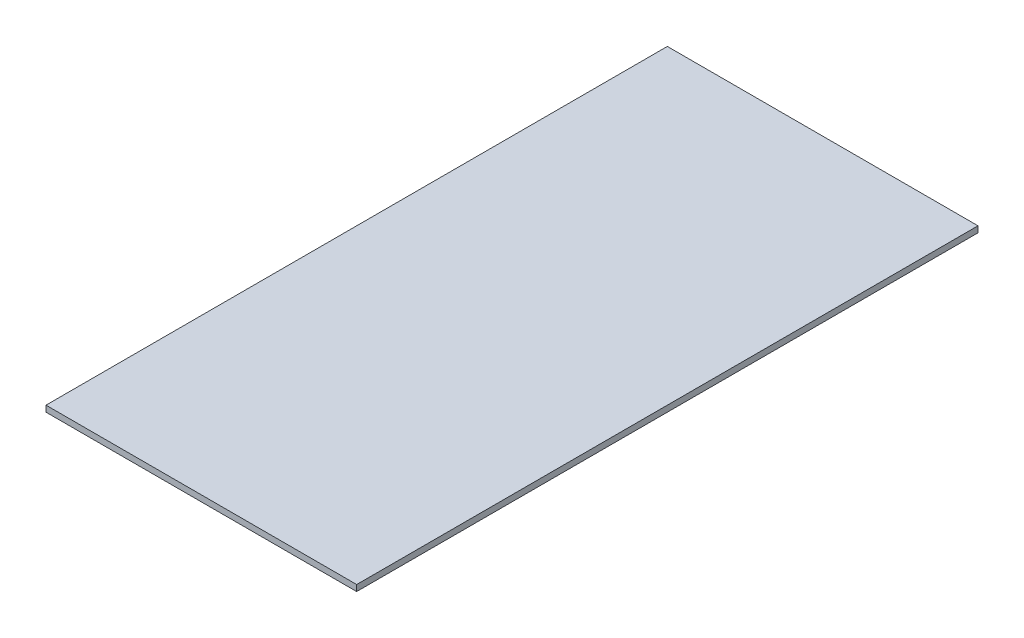
ISO-10303-21;
HEADER;
FILE_DESCRIPTION(('STEP AP214'),'2;1');
FILE_NAME('part.step','',(''),(''),'','','');
FILE_SCHEMA(('AUTOMOTIVE_DESIGN { 1 0 10303 214 1 1 1 1 }'));
ENDSEC;
DATA;
#1=APPLICATION_CONTEXT('core data for automotive mechanical design processes');
#2=APPLICATION_PROTOCOL_DEFINITION('international standard','automotive_design',2000,#1);
#3=PRODUCT_CONTEXT('',#1,'mechanical');
#4=PRODUCT('Part','Part','',(#3));
#5=PRODUCT_RELATED_PRODUCT_CATEGORY('part','',(#4));
#6=PRODUCT_DEFINITION_FORMATION('','',#4);
#7=PRODUCT_DEFINITION_CONTEXT('part definition',#1,'design');
#8=PRODUCT_DEFINITION('design','',#6,#7);
#9=PRODUCT_DEFINITION_SHAPE('','',#8);
#10=(LENGTH_UNIT() NAMED_UNIT(*) SI_UNIT(.MILLI.,.METRE.));
#11=(NAMED_UNIT(*) PLANE_ANGLE_UNIT() SI_UNIT($,.RADIAN.));
#12=(NAMED_UNIT(*) SI_UNIT($,.STERADIAN.) SOLID_ANGLE_UNIT());
#13=UNCERTAINTY_MEASURE_WITH_UNIT(LENGTH_MEASURE(1.E-05),#10,'distance_accuracy_value','');
#14=(GEOMETRIC_REPRESENTATION_CONTEXT(3) GLOBAL_UNCERTAINTY_ASSIGNED_CONTEXT((#13)) GLOBAL_UNIT_ASSIGNED_CONTEXT((#10,
#11,#12)) REPRESENTATION_CONTEXT('',''));
#15=CARTESIAN_POINT('',(0.,0.,0.));
#16=DIRECTION('',(0.,0.,1.));
#17=DIRECTION('',(1.,0.,0.));
#18=AXIS2_PLACEMENT_3D('',#15,#16,#17);
#19=CARTESIAN_POINT('',(25.4,1.,50.8));
#20=DIRECTION('',(-1.,0.,0.));
#21=DIRECTION('',(0.,0.,1.));
#22=AXIS2_PLACEMENT_3D('',#19,#20,#21);
#23=PLANE('',#22);
#24=DIRECTION('',(0.,0.,-1.));
#25=VECTOR('',#24,1.);
#26=CARTESIAN_POINT('',(25.4,0.,50.8));
#27=LINE('',#26,#25);
#28=CARTESIAN_POINT('',(25.4,0.,50.8));
#29=VERTEX_POINT('',#28);
#30=CARTESIAN_POINT('',(25.4,0.,-50.8));
#31=VERTEX_POINT('',#30);
#32=EDGE_CURVE('E109',#29,#31,#27,.T.);
#33=ORIENTED_EDGE('',*,*,#32,.T.);
#34=DIRECTION('',(0.,-1.,0.));
#35=VECTOR('',#34,1.);
#36=CARTESIAN_POINT('',(25.4,1.,-50.8));
#37=LINE('',#36,#35);
#38=CARTESIAN_POINT('',(25.4,1.,-50.8));
#39=VERTEX_POINT('',#38);
#40=EDGE_CURVE('E11',#39,#31,#37,.T.);
#41=ORIENTED_EDGE('',*,*,#40,.F.);
#42=DIRECTION('',(0.,0.,-1.));
#43=VECTOR('',#42,1.);
#44=CARTESIAN_POINT('',(25.4,1.,50.8));
#45=LINE('',#44,#43);
#46=CARTESIAN_POINT('',(25.4,1.,50.8));
#47=VERTEX_POINT('',#46);
#48=EDGE_CURVE('E93',#47,#39,#45,.T.);
#49=ORIENTED_EDGE('',*,*,#48,.F.);
#50=DIRECTION('',(0.,-1.,0.));
#51=VECTOR('',#50,1.);
#52=CARTESIAN_POINT('',(25.4,1.,50.8));
#53=LINE('',#52,#51);
#54=EDGE_CURVE('E105',#47,#29,#53,.T.);
#55=ORIENTED_EDGE('',*,*,#54,.T.);
#56=EDGE_LOOP('',(#33,#41,#49,#55));
#57=FACE_BOUND('',#56,.T.);
#58=ADVANCED_FACE('F41',(#57),#23,.F.);
#59=CARTESIAN_POINT('',(-25.4,1.,-50.8));
#60=DIRECTION('',(0.,0.,1.));
#61=DIRECTION('',(1.,0.,0.));
#62=AXIS2_PLACEMENT_3D('',#59,#60,#61);
#63=PLANE('',#62);
#64=DIRECTION('',(-1.,0.,0.));
#65=VECTOR('',#64,1.);
#66=CARTESIAN_POINT('',(-25.4,0.,-50.8));
#67=LINE('',#66,#65);
#68=CARTESIAN_POINT('',(-25.4,0.,-50.8));
#69=VERTEX_POINT('',#68);
#70=EDGE_CURVE('E98',#31,#69,#67,.T.);
#71=ORIENTED_EDGE('',*,*,#70,.T.);
#72=DIRECTION('',(0.,-1.,0.));
#73=VECTOR('',#72,1.);
#74=CARTESIAN_POINT('',(-25.4,1.,-50.8));
#75=LINE('',#74,#73);
#76=CARTESIAN_POINT('',(-25.4,1.,-50.8));
#77=VERTEX_POINT('',#76);
#78=EDGE_CURVE('E50',#77,#69,#75,.T.);
#79=ORIENTED_EDGE('',*,*,#78,.F.);
#80=DIRECTION('',(-1.,0.,0.));
#81=VECTOR('',#80,1.);
#82=CARTESIAN_POINT('',(-25.4,1.,-50.8));
#83=LINE('',#82,#81);
#84=EDGE_CURVE('E88',#39,#77,#83,.T.);
#85=ORIENTED_EDGE('',*,*,#84,.F.);
#86=ORIENTED_EDGE('',*,*,#40,.T.);
#87=EDGE_LOOP('',(#71,#79,#85,#86));
#88=FACE_BOUND('',#87,.T.);
#89=ADVANCED_FACE('F97',(#88),#63,.F.);
#90=CARTESIAN_POINT('',(-25.4,1.,50.8));
#91=DIRECTION('',(1.,0.,0.));
#92=DIRECTION('',(0.,0.,-1.));
#93=AXIS2_PLACEMENT_3D('',#90,#91,#92);
#94=PLANE('',#93);
#95=DIRECTION('',(0.,0.,1.));
#96=VECTOR('',#95,1.);
#97=CARTESIAN_POINT('',(-25.4,0.,50.8));
#98=LINE('',#97,#96);
#99=CARTESIAN_POINT('',(-25.4,0.,50.8));
#100=VERTEX_POINT('',#99);
#101=EDGE_CURVE('E75',#69,#100,#98,.T.);
#102=ORIENTED_EDGE('',*,*,#101,.T.);
#103=DIRECTION('',(0.,-1.,0.));
#104=VECTOR('',#103,1.);
#105=CARTESIAN_POINT('',(-25.4,1.,50.8));
#106=LINE('',#105,#104);
#107=CARTESIAN_POINT('',(-25.4,1.,50.8));
#108=VERTEX_POINT('',#107);
#109=EDGE_CURVE('E100',#108,#100,#106,.T.);
#110=ORIENTED_EDGE('',*,*,#109,.F.);
#111=DIRECTION('',(0.,0.,1.));
#112=VECTOR('',#111,1.);
#113=CARTESIAN_POINT('',(-25.4,1.,50.8));
#114=LINE('',#113,#112);
#115=EDGE_CURVE('E91',#77,#108,#114,.T.);
#116=ORIENTED_EDGE('',*,*,#115,.F.);
#117=ORIENTED_EDGE('',*,*,#78,.T.);
#118=EDGE_LOOP('',(#102,#110,#116,#117));
#119=FACE_BOUND('',#118,.T.);
#120=ADVANCED_FACE('F101',(#119),#94,.F.);
#121=CARTESIAN_POINT('',(-25.4,1.,50.8));
#122=DIRECTION('',(0.,0.,-1.));
#123=DIRECTION('',(-1.,0.,0.));
#124=AXIS2_PLACEMENT_3D('',#121,#122,#123);
#125=PLANE('',#124);
#126=DIRECTION('',(1.,0.,0.));
#127=VECTOR('',#126,1.);
#128=CARTESIAN_POINT('',(-25.4,0.,50.8));
#129=LINE('',#128,#127);
#130=EDGE_CURVE('E81',#100,#29,#129,.T.);
#131=ORIENTED_EDGE('',*,*,#130,.T.);
#132=ORIENTED_EDGE('',*,*,#54,.F.);
#133=DIRECTION('',(1.,0.,0.));
#134=VECTOR('',#133,1.);
#135=CARTESIAN_POINT('',(-25.4,1.,50.8));
#136=LINE('',#135,#134);
#137=EDGE_CURVE('E58',#108,#47,#136,.T.);
#138=ORIENTED_EDGE('',*,*,#137,.F.);
#139=ORIENTED_EDGE('',*,*,#109,.T.);
#140=EDGE_LOOP('',(#131,#132,#138,#139));
#141=FACE_BOUND('',#140,.T.);
#142=ADVANCED_FACE('F122',(#141),#125,.F.);
#143=CARTESIAN_POINT('',(0.,1.,0.));
#144=DIRECTION('',(0.,-1.,0.));
#145=DIRECTION('',(0.,0.,-1.));
#146=AXIS2_PLACEMENT_3D('',#143,#144,#145);
#147=PLANE('',#146);
#148=ORIENTED_EDGE('',*,*,#48,.T.);
#149=ORIENTED_EDGE('',*,*,#84,.T.);
#150=ORIENTED_EDGE('',*,*,#115,.T.);
#151=ORIENTED_EDGE('',*,*,#137,.T.);
#152=EDGE_LOOP('',(#148,#149,#150,#151));
#153=FACE_BOUND('',#152,.T.);
#154=ADVANCED_FACE('F89',(#153),#147,.F.);
#155=CARTESIAN_POINT('',(0.,0.,0.));
#156=DIRECTION('',(0.,-1.,0.));
#157=DIRECTION('',(0.,0.,-1.));
#158=AXIS2_PLACEMENT_3D('',#155,#156,#157);
#159=PLANE('',#158);
#160=ORIENTED_EDGE('',*,*,#32,.F.);
#161=ORIENTED_EDGE('',*,*,#130,.F.);
#162=ORIENTED_EDGE('',*,*,#101,.F.);
#163=ORIENTED_EDGE('',*,*,#70,.F.);
#164=EDGE_LOOP('',(#160,#161,#162,#163));
#165=FACE_BOUND('',#164,.T.);
#166=ADVANCED_FACE('F125',(#165),#159,.T.);
#167=CLOSED_SHELL('',(#58,#89,#120,#142,#154,#166));
#168=MANIFOLD_SOLID_BREP('B2',#167);
#169=ADVANCED_BREP_SHAPE_REPRESENTATION('',(#18,#168),#14);
#170=SHAPE_DEFINITION_REPRESENTATION(#9,#169);
ENDSEC;
END-ISO-10303-21;
